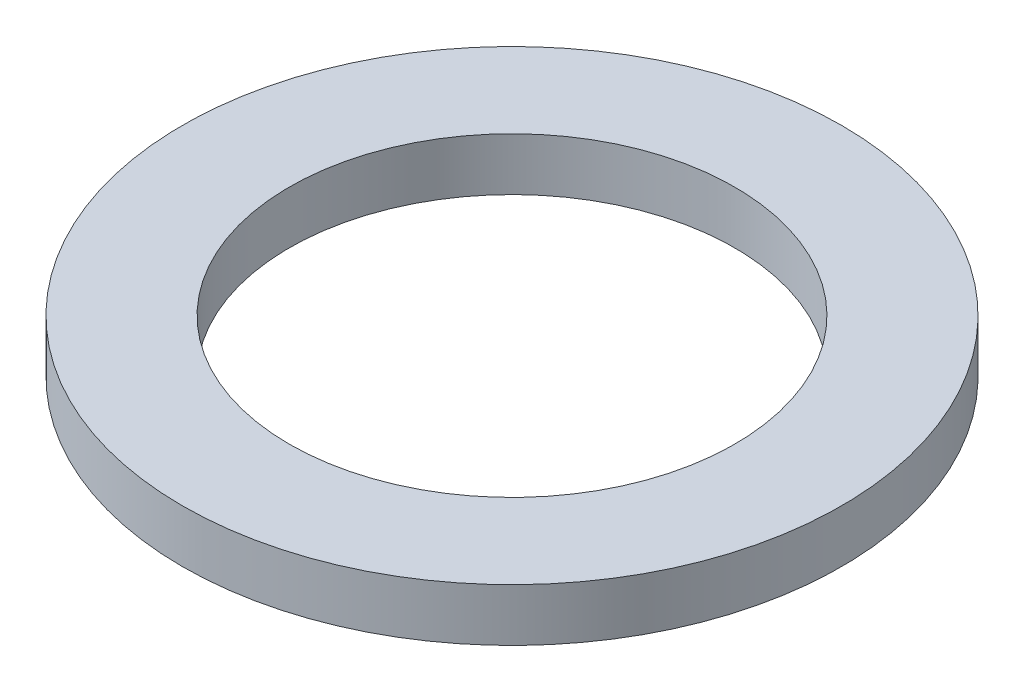
ISO-10303-21;
HEADER;
FILE_DESCRIPTION(('STEP AP214'),'2;1');
FILE_NAME('part.step','',(''),(''),'','','');
FILE_SCHEMA(('AUTOMOTIVE_DESIGN { 1 0 10303 214 1 1 1 1 }'));
ENDSEC;
DATA;
#1=APPLICATION_CONTEXT('core data for automotive mechanical design processes');
#2=APPLICATION_PROTOCOL_DEFINITION('international standard','automotive_design',2000,#1);
#3=PRODUCT_CONTEXT('',#1,'mechanical');
#4=PRODUCT('Part','Part','',(#3));
#5=PRODUCT_RELATED_PRODUCT_CATEGORY('part','',(#4));
#6=PRODUCT_DEFINITION_FORMATION('','',#4);
#7=PRODUCT_DEFINITION_CONTEXT('part definition',#1,'design');
#8=PRODUCT_DEFINITION('design','',#6,#7);
#9=PRODUCT_DEFINITION_SHAPE('','',#8);
#10=(LENGTH_UNIT() NAMED_UNIT(*) SI_UNIT(.MILLI.,.METRE.));
#11=(NAMED_UNIT(*) PLANE_ANGLE_UNIT() SI_UNIT($,.RADIAN.));
#12=(NAMED_UNIT(*) SI_UNIT($,.STERADIAN.) SOLID_ANGLE_UNIT());
#13=UNCERTAINTY_MEASURE_WITH_UNIT(LENGTH_MEASURE(1.E-05),#10,'distance_accuracy_value','');
#14=(GEOMETRIC_REPRESENTATION_CONTEXT(3) GLOBAL_UNCERTAINTY_ASSIGNED_CONTEXT((#13)) GLOBAL_UNIT_ASSIGNED_CONTEXT((#10,
#11,#12)) REPRESENTATION_CONTEXT('',''));
#15=CARTESIAN_POINT('',(0.,0.,0.));
#16=DIRECTION('',(0.,0.,1.));
#17=DIRECTION('',(1.,0.,0.));
#18=AXIS2_PLACEMENT_3D('',#15,#16,#17);
#19=CARTESIAN_POINT('',(0.,0.889,0.));
#20=DIRECTION('',(0.,-1.,0.));
#21=DIRECTION('',(0.,0.,-1.));
#22=AXIS2_PLACEMENT_3D('',#19,#20,#21);
#23=CYLINDRICAL_SURFACE('',#22,5.5626);
#24=CARTESIAN_POINT('',(0.,0.889,0.));
#25=DIRECTION('',(0.,1.,0.));
#26=DIRECTION('',(0.,0.,1.));
#27=AXIS2_PLACEMENT_3D('',#24,#25,#26);
#28=CIRCLE('',#27,5.5626);
#29=CARTESIAN_POINT('',(0.,0.889,5.5626));
#30=VERTEX_POINT('',#29);
#31=EDGE_CURVE('E10',#30,#30,#28,.T.);
#32=ORIENTED_EDGE('',*,*,#31,.F.);
#33=EDGE_LOOP('',(#32));
#34=FACE_BOUND('',#33,.T.);
#35=CARTESIAN_POINT('',(0.,0.,0.));
#36=DIRECTION('',(0.,1.,0.));
#37=DIRECTION('',(0.,0.,1.));
#38=AXIS2_PLACEMENT_3D('',#35,#36,#37);
#39=CIRCLE('',#38,5.5626);
#40=CARTESIAN_POINT('',(0.,0.,5.5626));
#41=VERTEX_POINT('',#40);
#42=EDGE_CURVE('E33',#41,#41,#39,.T.);
#43=ORIENTED_EDGE('',*,*,#42,.T.);
#44=EDGE_LOOP('',(#43));
#45=FACE_BOUND('',#44,.T.);
#46=ADVANCED_FACE('F30',(#34,#45),#23,.T.);
#47=CARTESIAN_POINT('',(0.,0.889,0.));
#48=DIRECTION('',(0.,1.,0.));
#49=DIRECTION('',(0.,0.,1.));
#50=AXIS2_PLACEMENT_3D('',#47,#48,#49);
#51=PLANE('',#50);
#52=CARTESIAN_POINT('',(0.,0.889,0.));
#53=DIRECTION('',(0.,1.,0.));
#54=DIRECTION('',(0.,0.,1.));
#55=AXIS2_PLACEMENT_3D('',#52,#53,#54);
#56=CIRCLE('',#55,3.7592);
#57=CARTESIAN_POINT('',(0.,0.889,3.7592));
#58=VERTEX_POINT('',#57);
#59=EDGE_CURVE('E42',#58,#58,#56,.T.);
#60=ORIENTED_EDGE('',*,*,#59,.F.);
#61=EDGE_LOOP('',(#60));
#62=FACE_BOUND('',#61,.T.);
#63=ORIENTED_EDGE('',*,*,#31,.T.);
#64=EDGE_LOOP('',(#63));
#65=FACE_BOUND('',#64,.T.);
#66=ADVANCED_FACE('F57',(#62,#65),#51,.T.);
#67=CARTESIAN_POINT('',(0.,0.,0.));
#68=DIRECTION('',(0.,1.,0.));
#69=DIRECTION('',(0.,0.,1.));
#70=AXIS2_PLACEMENT_3D('',#67,#68,#69);
#71=PLANE('',#70);
#72=CARTESIAN_POINT('',(0.,0.,0.));
#73=DIRECTION('',(0.,1.,0.));
#74=DIRECTION('',(0.,0.,1.));
#75=AXIS2_PLACEMENT_3D('',#72,#73,#74);
#76=CIRCLE('',#75,3.7592);
#77=CARTESIAN_POINT('',(0.,0.,3.7592));
#78=VERTEX_POINT('',#77);
#79=EDGE_CURVE('E40',#78,#78,#76,.T.);
#80=ORIENTED_EDGE('',*,*,#79,.T.);
#81=EDGE_LOOP('',(#80));
#82=FACE_BOUND('',#81,.T.);
#83=ORIENTED_EDGE('',*,*,#42,.F.);
#84=EDGE_LOOP('',(#83));
#85=FACE_BOUND('',#84,.T.);
#86=ADVANCED_FACE('F48',(#82,#85),#71,.F.);
#87=CARTESIAN_POINT('',(0.,0.,0.));
#88=DIRECTION('',(0.,1.,0.));
#89=DIRECTION('',(0.,0.,1.));
#90=AXIS2_PLACEMENT_3D('',#87,#88,#89);
#91=CYLINDRICAL_SURFACE('',#90,3.7592);
#92=ORIENTED_EDGE('',*,*,#79,.F.);
#93=EDGE_LOOP('',(#92));
#94=FACE_BOUND('',#93,.T.);
#95=ORIENTED_EDGE('',*,*,#59,.T.);
#96=EDGE_LOOP('',(#95));
#97=FACE_BOUND('',#96,.T.);
#98=ADVANCED_FACE('F51',(#94,#97),#91,.F.);
#99=CLOSED_SHELL('',(#46,#66,#86,#98));
#100=MANIFOLD_SOLID_BREP('B2',#99);
#101=ADVANCED_BREP_SHAPE_REPRESENTATION('',(#18,#100),#14);
#102=SHAPE_DEFINITION_REPRESENTATION(#9,#101);
ENDSEC;
END-ISO-10303-21;
